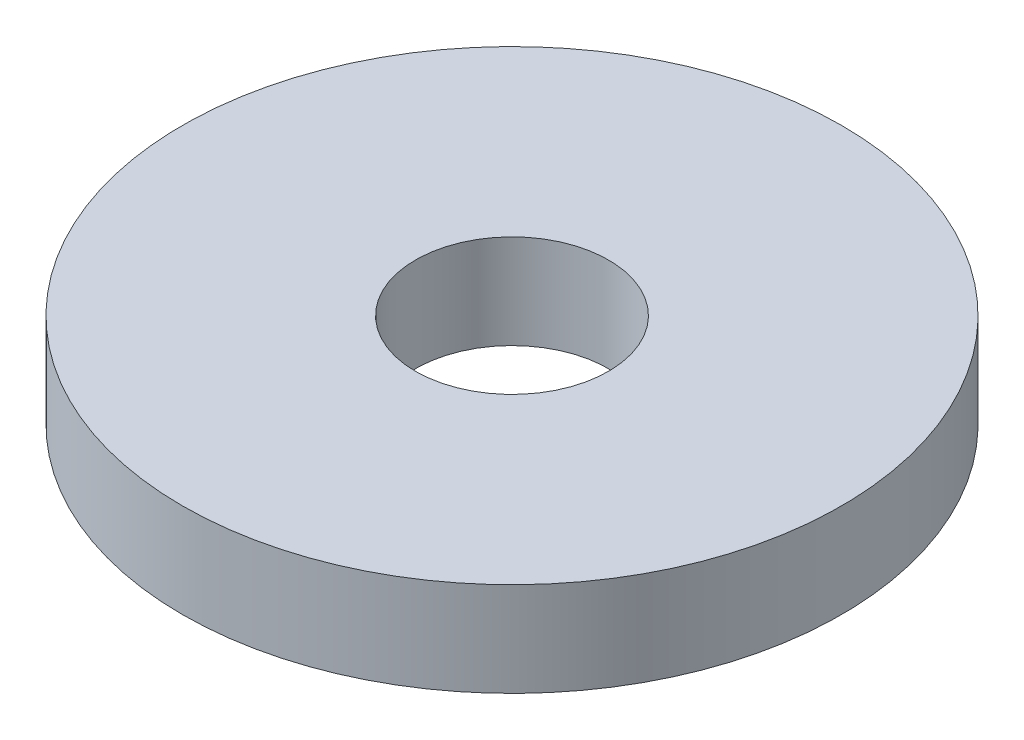
ISO-10303-21;
HEADER;
FILE_DESCRIPTION(('STEP AP214'),'2;1');
FILE_NAME('part.step','',(''),(''),'','','');
FILE_SCHEMA(('AUTOMOTIVE_DESIGN { 1 0 10303 214 1 1 1 1 }'));
ENDSEC;
DATA;
#1=APPLICATION_CONTEXT('core data for automotive mechanical design processes');
#2=APPLICATION_PROTOCOL_DEFINITION('international standard','automotive_design',2000,#1);
#3=PRODUCT_CONTEXT('',#1,'mechanical');
#4=PRODUCT('Part','Part','',(#3));
#5=PRODUCT_RELATED_PRODUCT_CATEGORY('part','',(#4));
#6=PRODUCT_DEFINITION_FORMATION('','',#4);
#7=PRODUCT_DEFINITION_CONTEXT('part definition',#1,'design');
#8=PRODUCT_DEFINITION('design','',#6,#7);
#9=PRODUCT_DEFINITION_SHAPE('','',#8);
#10=(LENGTH_UNIT() NAMED_UNIT(*) SI_UNIT(.MILLI.,.METRE.));
#11=(NAMED_UNIT(*) PLANE_ANGLE_UNIT() SI_UNIT($,.RADIAN.));
#12=(NAMED_UNIT(*) SI_UNIT($,.STERADIAN.) SOLID_ANGLE_UNIT());
#13=UNCERTAINTY_MEASURE_WITH_UNIT(LENGTH_MEASURE(1.E-05),#10,'distance_accuracy_value','');
#14=(GEOMETRIC_REPRESENTATION_CONTEXT(3) GLOBAL_UNCERTAINTY_ASSIGNED_CONTEXT((#13)) GLOBAL_UNIT_ASSIGNED_CONTEXT((#10,
#11,#12)) REPRESENTATION_CONTEXT('',''));
#15=CARTESIAN_POINT('',(0.,0.,0.));
#16=DIRECTION('',(0.,0.,1.));
#17=DIRECTION('',(1.,0.,0.));
#18=AXIS2_PLACEMENT_3D('',#15,#16,#17);
#19=CARTESIAN_POINT('',(0.,10.,0.));
#20=DIRECTION('',(0.,1.,0.));
#21=DIRECTION('',(0.,0.,1.));
#22=AXIS2_PLACEMENT_3D('',#19,#20,#21);
#23=PLANE('',#22);
#24=CARTESIAN_POINT('',(0.,10.,0.));
#25=DIRECTION('',(0.,1.,0.));
#26=DIRECTION('',(0.,0.,1.));
#27=AXIS2_PLACEMENT_3D('',#24,#25,#26);
#28=CIRCLE('',#27,35.);
#29=CARTESIAN_POINT('',(0.,10.,35.));
#30=VERTEX_POINT('',#29);
#31=EDGE_CURVE('E10',#30,#30,#28,.T.);
#32=ORIENTED_EDGE('',*,*,#31,.T.);
#33=EDGE_LOOP('',(#32));
#34=FACE_BOUND('',#33,.T.);
#35=CARTESIAN_POINT('',(0.,10.,0.));
#36=DIRECTION('',(0.,1.,0.));
#37=DIRECTION('',(0.,0.,1.));
#38=AXIS2_PLACEMENT_3D('',#35,#36,#37);
#39=CIRCLE('',#38,10.25);
#40=CARTESIAN_POINT('',(0.,10.,10.25));
#41=VERTEX_POINT('',#40);
#42=EDGE_CURVE('E50',#41,#41,#39,.T.);
#43=ORIENTED_EDGE('',*,*,#42,.F.);
#44=EDGE_LOOP('',(#43));
#45=FACE_BOUND('',#44,.T.);
#46=ADVANCED_FACE('F37',(#34,#45),#23,.T.);
#47=CARTESIAN_POINT('',(0.,0.,0.));
#48=DIRECTION('',(0.,1.,0.));
#49=DIRECTION('',(0.,0.,1.));
#50=AXIS2_PLACEMENT_3D('',#47,#48,#49);
#51=PLANE('',#50);
#52=CARTESIAN_POINT('',(0.,0.,0.));
#53=DIRECTION('',(0.,1.,0.));
#54=DIRECTION('',(0.,0.,1.));
#55=AXIS2_PLACEMENT_3D('',#52,#53,#54);
#56=CIRCLE('',#55,35.);
#57=CARTESIAN_POINT('',(0.,0.,35.));
#58=VERTEX_POINT('',#57);
#59=EDGE_CURVE('E41',#58,#58,#56,.T.);
#60=ORIENTED_EDGE('',*,*,#59,.F.);
#61=EDGE_LOOP('',(#60));
#62=FACE_BOUND('',#61,.T.);
#63=CARTESIAN_POINT('',(0.,0.,0.));
#64=DIRECTION('',(0.,1.,0.));
#65=DIRECTION('',(0.,0.,1.));
#66=AXIS2_PLACEMENT_3D('',#63,#64,#65);
#67=CIRCLE('',#66,10.25);
#68=CARTESIAN_POINT('',(0.,0.,10.25));
#69=VERTEX_POINT('',#68);
#70=EDGE_CURVE('E52',#69,#69,#67,.T.);
#71=ORIENTED_EDGE('',*,*,#70,.T.);
#72=EDGE_LOOP('',(#71));
#73=FACE_BOUND('',#72,.T.);
#74=ADVANCED_FACE('F64',(#62,#73),#51,.F.);
#75=CARTESIAN_POINT('',(0.,10.,0.));
#76=DIRECTION('',(0.,-1.,0.));
#77=DIRECTION('',(0.,0.,-1.));
#78=AXIS2_PLACEMENT_3D('',#75,#76,#77);
#79=CYLINDRICAL_SURFACE('',#78,35.);
#80=ORIENTED_EDGE('',*,*,#31,.F.);
#81=EDGE_LOOP('',(#80));
#82=FACE_BOUND('',#81,.T.);
#83=ORIENTED_EDGE('',*,*,#59,.T.);
#84=EDGE_LOOP('',(#83));
#85=FACE_BOUND('',#84,.T.);
#86=ADVANCED_FACE('F39',(#82,#85),#79,.T.);
#87=CARTESIAN_POINT('',(0.,10.,0.));
#88=DIRECTION('',(0.,-1.,0.));
#89=DIRECTION('',(0.,0.,-1.));
#90=AXIS2_PLACEMENT_3D('',#87,#88,#89);
#91=CYLINDRICAL_SURFACE('',#90,10.25);
#92=ORIENTED_EDGE('',*,*,#42,.T.);
#93=EDGE_LOOP('',(#92));
#94=FACE_BOUND('',#93,.T.);
#95=ORIENTED_EDGE('',*,*,#70,.F.);
#96=EDGE_LOOP('',(#95));
#97=FACE_BOUND('',#96,.T.);
#98=ADVANCED_FACE('F60',(#94,#97),#91,.F.);
#99=CLOSED_SHELL('',(#46,#74,#86,#98));
#100=MANIFOLD_SOLID_BREP('B2',#99);
#101=ADVANCED_BREP_SHAPE_REPRESENTATION('',(#18,#100),#14);
#102=SHAPE_DEFINITION_REPRESENTATION(#9,#101);
ENDSEC;
END-ISO-10303-21;
